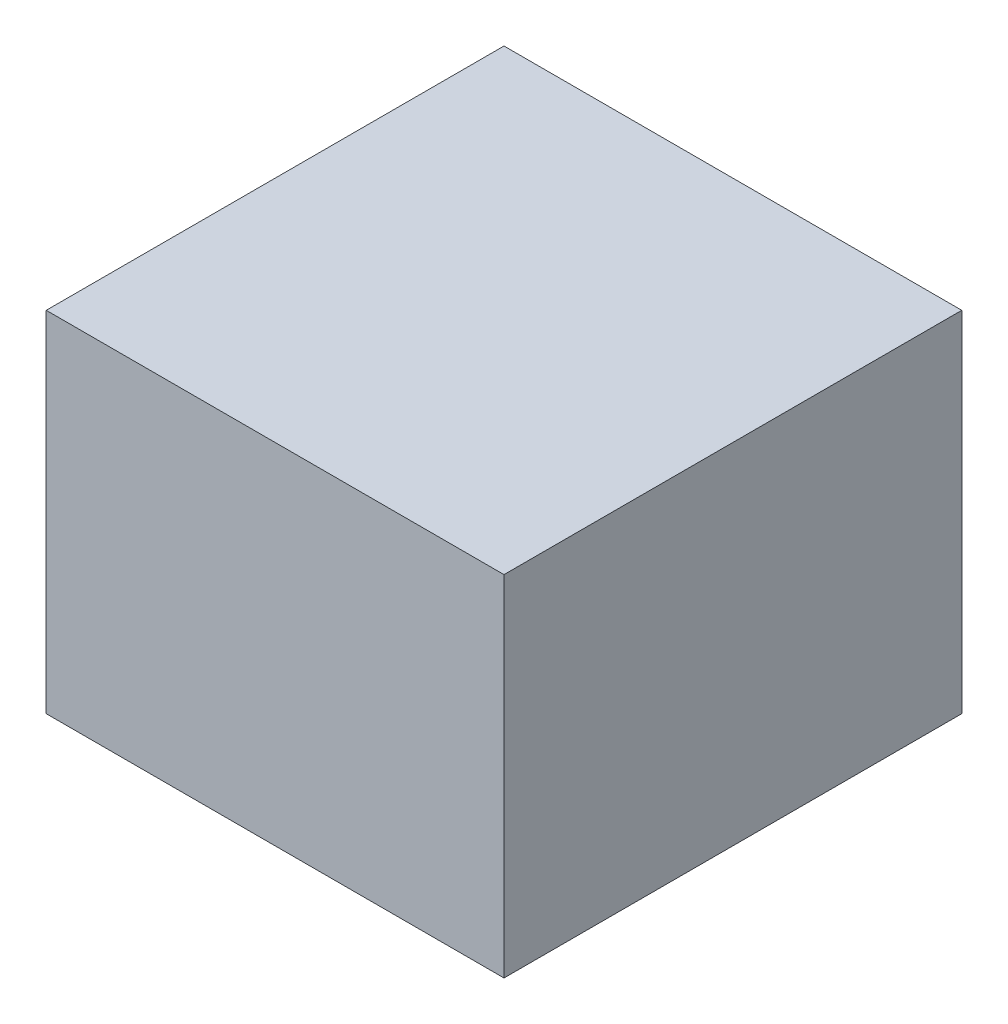
ISO-10303-21;
HEADER;
FILE_DESCRIPTION(('STEP AP214'),'2;1');
FILE_NAME('part.step','',(''),(''),'','','');
FILE_SCHEMA(('AUTOMOTIVE_DESIGN { 1 0 10303 214 1 1 1 1 }'));
ENDSEC;
DATA;
#1=APPLICATION_CONTEXT('core data for automotive mechanical design processes');
#2=APPLICATION_PROTOCOL_DEFINITION('international standard','automotive_design',2000,#1);
#3=PRODUCT_CONTEXT('',#1,'mechanical');
#4=PRODUCT('Part','Part','',(#3));
#5=PRODUCT_RELATED_PRODUCT_CATEGORY('part','',(#4));
#6=PRODUCT_DEFINITION_FORMATION('','',#4);
#7=PRODUCT_DEFINITION_CONTEXT('part definition',#1,'design');
#8=PRODUCT_DEFINITION('design','',#6,#7);
#9=PRODUCT_DEFINITION_SHAPE('','',#8);
#10=(LENGTH_UNIT() NAMED_UNIT(*) SI_UNIT(.MILLI.,.METRE.));
#11=(NAMED_UNIT(*) PLANE_ANGLE_UNIT() SI_UNIT($,.RADIAN.));
#12=(NAMED_UNIT(*) SI_UNIT($,.STERADIAN.) SOLID_ANGLE_UNIT());
#13=UNCERTAINTY_MEASURE_WITH_UNIT(LENGTH_MEASURE(1.E-05),#10,'distance_accuracy_value','');
#14=(GEOMETRIC_REPRESENTATION_CONTEXT(3) GLOBAL_UNCERTAINTY_ASSIGNED_CONTEXT((#13)) GLOBAL_UNIT_ASSIGNED_CONTEXT((#10,
#11,#12)) REPRESENTATION_CONTEXT('',''));
#15=CARTESIAN_POINT('',(0.,0.,0.));
#16=DIRECTION('',(0.,0.,1.));
#17=DIRECTION('',(1.,0.,0.));
#18=AXIS2_PLACEMENT_3D('',#15,#16,#17);
#19=CARTESIAN_POINT('',(-0.4826,0.3683,0.));
#20=DIRECTION('',(0.,1.,0.));
#21=DIRECTION('',(0.,0.,1.));
#22=AXIS2_PLACEMENT_3D('',#19,#20,#21);
#23=PLANE('',#22);
#24=DIRECTION('',(0.,0.,-1.));
#25=VECTOR('',#24,1.);
#26=CARTESIAN_POINT('',(0.4826,0.3683,0.));
#27=LINE('',#26,#25);
#28=CARTESIAN_POINT('',(0.4826,0.3683,0.));
#29=VERTEX_POINT('',#28);
#30=CARTESIAN_POINT('',(0.4826,0.3683,0.9652));
#31=VERTEX_POINT('',#30);
#32=EDGE_CURVE('E20',#29,#31,#27,.F.);
#33=ORIENTED_EDGE('',*,*,#32,.F.);
#34=DIRECTION('',(1.,0.,0.));
#35=VECTOR('',#34,1.);
#36=CARTESIAN_POINT('',(0.4826,0.3683,0.));
#37=LINE('',#36,#35);
#38=CARTESIAN_POINT('',(-0.4826,0.3683,0.));
#39=VERTEX_POINT('',#38);
#40=EDGE_CURVE('E80',#29,#39,#37,.F.);
#41=ORIENTED_EDGE('',*,*,#40,.T.);
#42=DIRECTION('',(0.,0.,1.));
#43=VECTOR('',#42,1.);
#44=CARTESIAN_POINT('',(-0.4826,0.3683,0.));
#45=LINE('',#44,#43);
#46=CARTESIAN_POINT('',(-0.4826,0.3683,0.9652));
#47=VERTEX_POINT('',#46);
#48=EDGE_CURVE('E68',#47,#39,#45,.F.);
#49=ORIENTED_EDGE('',*,*,#48,.F.);
#50=DIRECTION('',(1.,0.,0.));
#51=VECTOR('',#50,1.);
#52=CARTESIAN_POINT('',(0.4826,0.3683,0.9652));
#53=LINE('',#52,#51);
#54=EDGE_CURVE('E56',#31,#47,#53,.F.);
#55=ORIENTED_EDGE('',*,*,#54,.F.);
#56=EDGE_LOOP('',(#33,#41,#49,#55));
#57=FACE_BOUND('',#56,.T.);
#58=ADVANCED_FACE('F17',(#57),#23,.T.);
#59=CARTESIAN_POINT('',(0.4826,0.3683,0.));
#60=DIRECTION('',(1.,0.,0.));
#61=DIRECTION('',(0.,0.,-1.));
#62=AXIS2_PLACEMENT_3D('',#59,#60,#61);
#63=PLANE('',#62);
#64=DIRECTION('',(0.,0.,-1.));
#65=VECTOR('',#64,1.);
#66=CARTESIAN_POINT('',(0.4826,-0.3683,0.));
#67=LINE('',#66,#65);
#68=CARTESIAN_POINT('',(0.4826,-0.3683,0.));
#69=VERTEX_POINT('',#68);
#70=CARTESIAN_POINT('',(0.4826,-0.3683,0.9652));
#71=VERTEX_POINT('',#70);
#72=EDGE_CURVE('E83',#69,#71,#67,.F.);
#73=ORIENTED_EDGE('',*,*,#72,.F.);
#74=DIRECTION('',(0.,1.,0.));
#75=VECTOR('',#74,1.);
#76=CARTESIAN_POINT('',(0.4826,-0.3683,0.));
#77=LINE('',#76,#75);
#78=EDGE_CURVE('E65',#69,#29,#77,.T.);
#79=ORIENTED_EDGE('',*,*,#78,.T.);
#80=ORIENTED_EDGE('',*,*,#32,.T.);
#81=DIRECTION('',(0.,1.,0.));
#82=VECTOR('',#81,1.);
#83=CARTESIAN_POINT('',(0.4826,-0.3683,0.9652));
#84=LINE('',#83,#82);
#85=EDGE_CURVE('E62',#71,#31,#84,.T.);
#86=ORIENTED_EDGE('',*,*,#85,.F.);
#87=EDGE_LOOP('',(#73,#79,#80,#86));
#88=FACE_BOUND('',#87,.T.);
#89=ADVANCED_FACE('F61',(#88),#63,.T.);
#90=CARTESIAN_POINT('',(0.4826,-0.3683,0.9652));
#91=DIRECTION('',(0.,0.,1.));
#92=DIRECTION('',(1.,0.,0.));
#93=AXIS2_PLACEMENT_3D('',#90,#91,#92);
#94=PLANE('',#93);
#95=DIRECTION('',(0.,1.,0.));
#96=VECTOR('',#95,1.);
#97=CARTESIAN_POINT('',(-0.4826,-0.3683,0.9652));
#98=LINE('',#97,#96);
#99=CARTESIAN_POINT('',(-0.4826,-0.3683,0.9652));
#100=VERTEX_POINT('',#99);
#101=EDGE_CURVE('E70',#100,#47,#98,.T.);
#102=ORIENTED_EDGE('',*,*,#101,.F.);
#103=DIRECTION('',(1.,0.,0.));
#104=VECTOR('',#103,1.);
#105=CARTESIAN_POINT('',(0.4826,-0.3683,0.9652));
#106=LINE('',#105,#104);
#107=EDGE_CURVE('E74',#71,#100,#106,.F.);
#108=ORIENTED_EDGE('',*,*,#107,.F.);
#109=ORIENTED_EDGE('',*,*,#85,.T.);
#110=ORIENTED_EDGE('',*,*,#54,.T.);
#111=EDGE_LOOP('',(#102,#108,#109,#110));
#112=FACE_BOUND('',#111,.T.);
#113=ADVANCED_FACE('F72',(#112),#94,.T.);
#114=CARTESIAN_POINT('',(-0.4826,-0.3683,0.));
#115=DIRECTION('',(-1.,0.,0.));
#116=DIRECTION('',(0.,0.,1.));
#117=AXIS2_PLACEMENT_3D('',#114,#115,#116);
#118=PLANE('',#117);
#119=ORIENTED_EDGE('',*,*,#48,.T.);
#120=DIRECTION('',(0.,1.,0.));
#121=VECTOR('',#120,1.);
#122=CARTESIAN_POINT('',(-0.4826,-0.3683,0.));
#123=LINE('',#122,#121);
#124=CARTESIAN_POINT('',(-0.4826,-0.3683,0.));
#125=VERTEX_POINT('',#124);
#126=EDGE_CURVE('E35',#39,#125,#123,.F.);
#127=ORIENTED_EDGE('',*,*,#126,.T.);
#128=DIRECTION('',(0.,0.,-1.));
#129=VECTOR('',#128,1.);
#130=CARTESIAN_POINT('',(-0.4826,-0.3683,0.));
#131=LINE('',#130,#129);
#132=EDGE_CURVE('E26',#100,#125,#131,.T.);
#133=ORIENTED_EDGE('',*,*,#132,.F.);
#134=ORIENTED_EDGE('',*,*,#101,.T.);
#135=EDGE_LOOP('',(#119,#127,#133,#134));
#136=FACE_BOUND('',#135,.T.);
#137=ADVANCED_FACE('F89',(#136),#118,.T.);
#138=CARTESIAN_POINT('',(0.4826,-0.3683,0.));
#139=DIRECTION('',(0.,0.,1.));
#140=DIRECTION('',(1.,0.,0.));
#141=AXIS2_PLACEMENT_3D('',#138,#139,#140);
#142=PLANE('',#141);
#143=ORIENTED_EDGE('',*,*,#126,.F.);
#144=ORIENTED_EDGE('',*,*,#40,.F.);
#145=ORIENTED_EDGE('',*,*,#78,.F.);
#146=DIRECTION('',(1.,0.,0.));
#147=VECTOR('',#146,1.);
#148=CARTESIAN_POINT('',(0.4826,-0.3683,0.));
#149=LINE('',#148,#147);
#150=EDGE_CURVE('E11',#125,#69,#149,.T.);
#151=ORIENTED_EDGE('',*,*,#150,.F.);
#152=EDGE_LOOP('',(#143,#144,#145,#151));
#153=FACE_BOUND('',#152,.T.);
#154=ADVANCED_FACE('F91',(#153),#142,.F.);
#155=CARTESIAN_POINT('',(0.4826,-0.3683,0.));
#156=DIRECTION('',(0.,-1.,0.));
#157=DIRECTION('',(0.,0.,-1.));
#158=AXIS2_PLACEMENT_3D('',#155,#156,#157);
#159=PLANE('',#158);
#160=ORIENTED_EDGE('',*,*,#132,.T.);
#161=ORIENTED_EDGE('',*,*,#150,.T.);
#162=ORIENTED_EDGE('',*,*,#72,.T.);
#163=ORIENTED_EDGE('',*,*,#107,.T.);
#164=EDGE_LOOP('',(#160,#161,#162,#163));
#165=FACE_BOUND('',#164,.T.);
#166=ADVANCED_FACE('F88',(#165),#159,.T.);
#167=CLOSED_SHELL('',(#58,#89,#113,#137,#154,#166));
#168=MANIFOLD_SOLID_BREP('B1',#167);
#169=ADVANCED_BREP_SHAPE_REPRESENTATION('',(#18,#168),#14);
#170=SHAPE_DEFINITION_REPRESENTATION(#9,#169);
ENDSEC;
END-ISO-10303-21;
